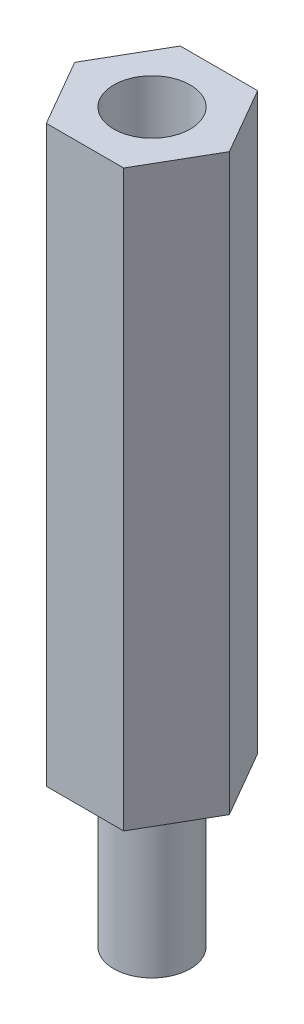
ISO-10303-21;
HEADER;
FILE_DESCRIPTION(('STEP AP214'),'2;1');
FILE_NAME('part.step','',(''),(''),'','','');
FILE_SCHEMA(('AUTOMOTIVE_DESIGN { 1 0 10303 214 1 1 1 1 }'));
ENDSEC;
DATA;
#1=APPLICATION_CONTEXT('core data for automotive mechanical design processes');
#2=APPLICATION_PROTOCOL_DEFINITION('international standard','automotive_design',2000,#1);
#3=PRODUCT_CONTEXT('',#1,'mechanical');
#4=PRODUCT('Part','Part','',(#3));
#5=PRODUCT_RELATED_PRODUCT_CATEGORY('part','',(#4));
#6=PRODUCT_DEFINITION_FORMATION('','',#4);
#7=PRODUCT_DEFINITION_CONTEXT('part definition',#1,'design');
#8=PRODUCT_DEFINITION('design','',#6,#7);
#9=PRODUCT_DEFINITION_SHAPE('','',#8);
#10=(LENGTH_UNIT() NAMED_UNIT(*) SI_UNIT(.MILLI.,.METRE.));
#11=(NAMED_UNIT(*) PLANE_ANGLE_UNIT() SI_UNIT($,.RADIAN.));
#12=(NAMED_UNIT(*) SI_UNIT($,.STERADIAN.) SOLID_ANGLE_UNIT());
#13=UNCERTAINTY_MEASURE_WITH_UNIT(LENGTH_MEASURE(1.E-05),#10,'distance_accuracy_value','');
#14=(GEOMETRIC_REPRESENTATION_CONTEXT(3) GLOBAL_UNCERTAINTY_ASSIGNED_CONTEXT((#13)) GLOBAL_UNIT_ASSIGNED_CONTEXT((#10,
#11,#12)) REPRESENTATION_CONTEXT('',''));
#15=CARTESIAN_POINT('',(0.,0.,0.));
#16=DIRECTION('',(0.,0.,1.));
#17=DIRECTION('',(1.,0.,0.));
#18=AXIS2_PLACEMENT_3D('',#15,#16,#17);
#19=CARTESIAN_POINT('',(0.,-8.,0.));
#20=DIRECTION('',(0.,1.,0.));
#21=DIRECTION('',(0.,0.,1.));
#22=AXIS2_PLACEMENT_3D('',#19,#20,#21);
#23=CYLINDRICAL_SURFACE('',#22,2.);
#24=CARTESIAN_POINT('',(0.,-8.,0.));
#25=DIRECTION('',(0.,-1.,0.));
#26=DIRECTION('',(0.,0.,-1.));
#27=AXIS2_PLACEMENT_3D('',#24,#25,#26);
#28=CIRCLE('',#27,2.);
#29=CARTESIAN_POINT('',(0.,-8.,-2.));
#30=VERTEX_POINT('',#29);
#31=EDGE_CURVE('E11',#30,#30,#28,.T.);
#32=ORIENTED_EDGE('',*,*,#31,.F.);
#33=EDGE_LOOP('',(#32));
#34=FACE_BOUND('',#33,.T.);
#35=CARTESIAN_POINT('',(0.,0.,0.));
#36=DIRECTION('',(0.,-1.,0.));
#37=DIRECTION('',(0.,0.,-1.));
#38=AXIS2_PLACEMENT_3D('',#35,#36,#37);
#39=CIRCLE('',#38,2.);
#40=CARTESIAN_POINT('',(0.,0.,-2.));
#41=VERTEX_POINT('',#40);
#42=EDGE_CURVE('E45',#41,#41,#39,.T.);
#43=ORIENTED_EDGE('',*,*,#42,.T.);
#44=EDGE_LOOP('',(#43));
#45=FACE_BOUND('',#44,.T.);
#46=ADVANCED_FACE('F42',(#34,#45),#23,.T.);
#47=CARTESIAN_POINT('',(0.,-8.,0.));
#48=DIRECTION('',(0.,-1.,0.));
#49=DIRECTION('',(0.,0.,-1.));
#50=AXIS2_PLACEMENT_3D('',#47,#48,#49);
#51=PLANE('',#50);
#52=ORIENTED_EDGE('',*,*,#31,.T.);
#53=EDGE_LOOP('',(#52));
#54=FACE_BOUND('',#53,.T.);
#55=ADVANCED_FACE('F57',(#54),#51,.T.);
#56=CARTESIAN_POINT('',(0.,0.,0.));
#57=DIRECTION('',(0.,-1.,0.));
#58=DIRECTION('',(0.,0.,-1.));
#59=AXIS2_PLACEMENT_3D('',#56,#57,#58);
#60=PLANE('',#59);
#61=ORIENTED_EDGE('',*,*,#42,.F.);
#62=EDGE_LOOP('',(#61));
#63=FACE_BOUND('',#62,.T.);
#64=ADVANCED_FACE('F55',(#63),#60,.F.);
#65=CLOSED_SHELL('',(#46,#55,#64));
#66=MANIFOLD_SOLID_BREP('B2',#65);
#67=CARTESIAN_POINT('',(0.,30.,0.));
#68=DIRECTION('',(0.,1.,0.));
#69=DIRECTION('',(0.,0.,1.));
#70=AXIS2_PLACEMENT_3D('',#67,#68,#69);
#71=PLANE('',#70);
#72=DIRECTION('',(0.5,0.,-0.866025403784439));
#73=VECTOR('',#72,1.);
#74=CARTESIAN_POINT('',(2.02072594216369,30.,3.5));
#75=LINE('',#74,#73);
#76=CARTESIAN_POINT('',(2.02072594216369,30.,3.5));
#77=VERTEX_POINT('',#76);
#78=CARTESIAN_POINT('',(4.04145188432738,30.,0.));
#79=VERTEX_POINT('',#78);
#80=EDGE_CURVE('E178',#77,#79,#75,.T.);
#81=ORIENTED_EDGE('',*,*,#80,.T.);
#82=DIRECTION('',(-0.5,0.,-0.866025403784438));
#83=VECTOR('',#82,1.);
#84=CARTESIAN_POINT('',(4.04145188432738,30.,0.));
#85=LINE('',#84,#83);
#86=CARTESIAN_POINT('',(2.02072594216369,30.,-3.5));
#87=VERTEX_POINT('',#86);
#88=EDGE_CURVE('E136',#79,#87,#85,.T.);
#89=ORIENTED_EDGE('',*,*,#88,.T.);
#90=DIRECTION('',(-1.,0.,0.));
#91=VECTOR('',#90,1.);
#92=CARTESIAN_POINT('',(2.02072594216369,30.,-3.5));
#93=LINE('',#92,#91);
#94=CARTESIAN_POINT('',(-2.02072594216369,30.,-3.5));
#95=VERTEX_POINT('',#94);
#96=EDGE_CURVE('E149',#87,#95,#93,.T.);
#97=ORIENTED_EDGE('',*,*,#96,.T.);
#98=DIRECTION('',(-0.5,0.,0.866025403784439));
#99=VECTOR('',#98,1.);
#100=CARTESIAN_POINT('',(-2.02072594216369,30.,-3.5));
#101=LINE('',#100,#99);
#102=CARTESIAN_POINT('',(-4.04145188432738,30.,0.));
#103=VERTEX_POINT('',#102);
#104=EDGE_CURVE('E143',#95,#103,#101,.T.);
#105=ORIENTED_EDGE('',*,*,#104,.T.);
#106=DIRECTION('',(0.5,0.,0.866025403784438));
#107=VECTOR('',#106,1.);
#108=CARTESIAN_POINT('',(-4.04145188432738,30.,0.));
#109=LINE('',#108,#107);
#110=CARTESIAN_POINT('',(-2.02072594216369,30.,3.5));
#111=VERTEX_POINT('',#110);
#112=EDGE_CURVE('E147',#103,#111,#109,.T.);
#113=ORIENTED_EDGE('',*,*,#112,.T.);
#114=DIRECTION('',(1.,0.,0.));
#115=VECTOR('',#114,1.);
#116=CARTESIAN_POINT('',(-2.02072594216369,30.,3.5));
#117=LINE('',#116,#115);
#118=EDGE_CURVE('E99',#111,#77,#117,.T.);
#119=ORIENTED_EDGE('',*,*,#118,.T.);
#120=EDGE_LOOP('',(#81,#89,#97,#105,#113,#119));
#121=FACE_BOUND('',#120,.T.);
#122=CARTESIAN_POINT('',(0.,30.,0.));
#123=DIRECTION('',(0.,1.,0.));
#124=DIRECTION('',(0.,0.,1.));
#125=AXIS2_PLACEMENT_3D('',#122,#123,#124);
#126=CIRCLE('',#125,2.);
#127=CARTESIAN_POINT('',(0.,30.,2.));
#128=VERTEX_POINT('',#127);
#129=EDGE_CURVE('E171',#128,#128,#126,.T.);
#130=ORIENTED_EDGE('',*,*,#129,.F.);
#131=EDGE_LOOP('',(#130));
#132=FACE_BOUND('',#131,.T.);
#133=ADVANCED_FACE('F82',(#121,#132),#71,.T.);
#134=CARTESIAN_POINT('',(0.,0.,0.));
#135=DIRECTION('',(0.,1.,0.));
#136=DIRECTION('',(0.,0.,1.));
#137=AXIS2_PLACEMENT_3D('',#134,#135,#136);
#138=PLANE('',#137);
#139=DIRECTION('',(0.5,0.,-0.866025403784439));
#140=VECTOR('',#139,1.);
#141=CARTESIAN_POINT('',(2.02072594216369,0.,3.5));
#142=LINE('',#141,#140);
#143=CARTESIAN_POINT('',(2.02072594216369,0.,3.5));
#144=VERTEX_POINT('',#143);
#145=CARTESIAN_POINT('',(4.04145188432738,0.,0.));
#146=VERTEX_POINT('',#145);
#147=EDGE_CURVE('E167',#144,#146,#142,.T.);
#148=ORIENTED_EDGE('',*,*,#147,.F.);
#149=DIRECTION('',(1.,0.,0.));
#150=VECTOR('',#149,1.);
#151=CARTESIAN_POINT('',(-2.02072594216369,0.,3.5));
#152=LINE('',#151,#150);
#153=CARTESIAN_POINT('',(-2.02072594216369,0.,3.5));
#154=VERTEX_POINT('',#153);
#155=EDGE_CURVE('E128',#154,#144,#152,.T.);
#156=ORIENTED_EDGE('',*,*,#155,.F.);
#157=DIRECTION('',(0.5,0.,0.866025403784438));
#158=VECTOR('',#157,1.);
#159=CARTESIAN_POINT('',(-4.04145188432738,0.,0.));
#160=LINE('',#159,#158);
#161=CARTESIAN_POINT('',(-4.04145188432738,0.,0.));
#162=VERTEX_POINT('',#161);
#163=EDGE_CURVE('E122',#162,#154,#160,.T.);
#164=ORIENTED_EDGE('',*,*,#163,.F.);
#165=DIRECTION('',(-0.5,0.,0.866025403784439));
#166=VECTOR('',#165,1.);
#167=CARTESIAN_POINT('',(-2.02072594216369,0.,-3.5));
#168=LINE('',#167,#166);
#169=CARTESIAN_POINT('',(-2.02072594216369,0.,-3.5));
#170=VERTEX_POINT('',#169);
#171=EDGE_CURVE('E157',#170,#162,#168,.T.);
#172=ORIENTED_EDGE('',*,*,#171,.F.);
#173=DIRECTION('',(-1.,0.,0.));
#174=VECTOR('',#173,1.);
#175=CARTESIAN_POINT('',(2.02072594216369,0.,-3.5));
#176=LINE('',#175,#174);
#177=CARTESIAN_POINT('',(2.02072594216369,0.,-3.5));
#178=VERTEX_POINT('',#177);
#179=EDGE_CURVE('E173',#178,#170,#176,.T.);
#180=ORIENTED_EDGE('',*,*,#179,.F.);
#181=DIRECTION('',(-0.5,0.,-0.866025403784438));
#182=VECTOR('',#181,1.);
#183=CARTESIAN_POINT('',(4.04145188432738,0.,0.));
#184=LINE('',#183,#182);
#185=EDGE_CURVE('E170',#146,#178,#184,.T.);
#186=ORIENTED_EDGE('',*,*,#185,.F.);
#187=EDGE_LOOP('',(#148,#156,#164,#172,#180,#186));
#188=FACE_BOUND('',#187,.T.);
#189=CARTESIAN_POINT('',(0.,0.,0.));
#190=DIRECTION('',(0.,1.,0.));
#191=DIRECTION('',(0.,0.,1.));
#192=AXIS2_PLACEMENT_3D('',#189,#190,#191);
#193=CIRCLE('',#192,2.);
#194=CARTESIAN_POINT('',(0.,0.,2.));
#195=VERTEX_POINT('',#194);
#196=EDGE_CURVE('E271',#195,#195,#193,.T.);
#197=ORIENTED_EDGE('',*,*,#196,.T.);
#198=EDGE_LOOP('',(#197));
#199=FACE_BOUND('',#198,.T.);
#200=ADVANCED_FACE('F187',(#188,#199),#138,.F.);
#201=CARTESIAN_POINT('',(2.02072594216369,30.,3.5));
#202=DIRECTION('',(-0.866025403784438,0.,-0.5));
#203=DIRECTION('',(-0.5,0.,0.866025403784439));
#204=AXIS2_PLACEMENT_3D('',#201,#202,#203);
#205=PLANE('',#204);
#206=ORIENTED_EDGE('',*,*,#147,.T.);
#207=DIRECTION('',(0.,-1.,0.));
#208=VECTOR('',#207,1.);
#209=CARTESIAN_POINT('',(4.04145188432738,30.,0.));
#210=LINE('',#209,#208);
#211=EDGE_CURVE('E40',#79,#146,#210,.T.);
#212=ORIENTED_EDGE('',*,*,#211,.F.);
#213=ORIENTED_EDGE('',*,*,#80,.F.);
#214=DIRECTION('',(0.,-1.,0.));
#215=VECTOR('',#214,1.);
#216=CARTESIAN_POINT('',(2.02072594216369,30.,3.5));
#217=LINE('',#216,#215);
#218=EDGE_CURVE('E163',#77,#144,#217,.T.);
#219=ORIENTED_EDGE('',*,*,#218,.T.);
#220=EDGE_LOOP('',(#206,#212,#213,#219));
#221=FACE_BOUND('',#220,.T.);
#222=ADVANCED_FACE('F84',(#221),#205,.F.);
#223=CARTESIAN_POINT('',(4.04145188432738,30.,0.));
#224=DIRECTION('',(-0.866025403784438,0.,0.5));
#225=DIRECTION('',(0.5,0.,0.866025403784439));
#226=AXIS2_PLACEMENT_3D('',#223,#224,#225);
#227=PLANE('',#226);
#228=ORIENTED_EDGE('',*,*,#185,.T.);
#229=DIRECTION('',(0.,-1.,0.));
#230=VECTOR('',#229,1.);
#231=CARTESIAN_POINT('',(2.02072594216369,30.,-3.5));
#232=LINE('',#231,#230);
#233=EDGE_CURVE('E91',#87,#178,#232,.T.);
#234=ORIENTED_EDGE('',*,*,#233,.F.);
#235=ORIENTED_EDGE('',*,*,#88,.F.);
#236=ORIENTED_EDGE('',*,*,#211,.T.);
#237=EDGE_LOOP('',(#228,#234,#235,#236));
#238=FACE_BOUND('',#237,.T.);
#239=ADVANCED_FACE('F212',(#238),#227,.F.);
#240=CARTESIAN_POINT('',(2.02072594216369,30.,-3.5));
#241=DIRECTION('',(0.,0.,1.));
#242=DIRECTION('',(1.,0.,0.));
#243=AXIS2_PLACEMENT_3D('',#240,#241,#242);
#244=PLANE('',#243);
#245=ORIENTED_EDGE('',*,*,#179,.T.);
#246=DIRECTION('',(0.,-1.,0.));
#247=VECTOR('',#246,1.);
#248=CARTESIAN_POINT('',(-2.02072594216369,30.,-3.5));
#249=LINE('',#248,#247);
#250=EDGE_CURVE('E158',#95,#170,#249,.T.);
#251=ORIENTED_EDGE('',*,*,#250,.F.);
#252=ORIENTED_EDGE('',*,*,#96,.F.);
#253=ORIENTED_EDGE('',*,*,#233,.T.);
#254=EDGE_LOOP('',(#245,#251,#252,#253));
#255=FACE_BOUND('',#254,.T.);
#256=ADVANCED_FACE('F184',(#255),#244,.F.);
#257=CARTESIAN_POINT('',(-2.02072594216369,30.,-3.5));
#258=DIRECTION('',(0.866025403784438,0.,0.5));
#259=DIRECTION('',(0.5,0.,-0.866025403784439));
#260=AXIS2_PLACEMENT_3D('',#257,#258,#259);
#261=PLANE('',#260);
#262=ORIENTED_EDGE('',*,*,#171,.T.);
#263=DIRECTION('',(0.,-1.,0.));
#264=VECTOR('',#263,1.);
#265=CARTESIAN_POINT('',(-4.04145188432738,30.,0.));
#266=LINE('',#265,#264);
#267=EDGE_CURVE('E154',#103,#162,#266,.T.);
#268=ORIENTED_EDGE('',*,*,#267,.F.);
#269=ORIENTED_EDGE('',*,*,#104,.F.);
#270=ORIENTED_EDGE('',*,*,#250,.T.);
#271=EDGE_LOOP('',(#262,#268,#269,#270));
#272=FACE_BOUND('',#271,.T.);
#273=ADVANCED_FACE('F155',(#272),#261,.F.);
#274=CARTESIAN_POINT('',(-4.04145188432738,30.,0.));
#275=DIRECTION('',(0.866025403784438,0.,-0.5));
#276=DIRECTION('',(-0.5,0.,-0.866025403784438));
#277=AXIS2_PLACEMENT_3D('',#274,#275,#276);
#278=PLANE('',#277);
#279=ORIENTED_EDGE('',*,*,#163,.T.);
#280=DIRECTION('',(0.,-1.,0.));
#281=VECTOR('',#280,1.);
#282=CARTESIAN_POINT('',(-2.02072594216369,30.,3.5));
#283=LINE('',#282,#281);
#284=EDGE_CURVE('E159',#111,#154,#283,.T.);
#285=ORIENTED_EDGE('',*,*,#284,.F.);
#286=ORIENTED_EDGE('',*,*,#112,.F.);
#287=ORIENTED_EDGE('',*,*,#267,.T.);
#288=EDGE_LOOP('',(#279,#285,#286,#287));
#289=FACE_BOUND('',#288,.T.);
#290=ADVANCED_FACE('F161',(#289),#278,.F.);
#291=CARTESIAN_POINT('',(-2.02072594216369,30.,3.5));
#292=DIRECTION('',(0.,0.,-1.));
#293=DIRECTION('',(-1.,0.,0.));
#294=AXIS2_PLACEMENT_3D('',#291,#292,#293);
#295=PLANE('',#294);
#296=ORIENTED_EDGE('',*,*,#155,.T.);
#297=ORIENTED_EDGE('',*,*,#218,.F.);
#298=ORIENTED_EDGE('',*,*,#118,.F.);
#299=ORIENTED_EDGE('',*,*,#284,.T.);
#300=EDGE_LOOP('',(#296,#297,#298,#299));
#301=FACE_BOUND('',#300,.T.);
#302=ADVANCED_FACE('F192',(#301),#295,.F.);
#303=CARTESIAN_POINT('',(0.,30.,0.));
#304=DIRECTION('',(0.,-1.,0.));
#305=DIRECTION('',(0.,0.,-1.));
#306=AXIS2_PLACEMENT_3D('',#303,#304,#305);
#307=CYLINDRICAL_SURFACE('',#306,2.);
#308=ORIENTED_EDGE('',*,*,#129,.T.);
#309=EDGE_LOOP('',(#308));
#310=FACE_BOUND('',#309,.T.);
#311=ORIENTED_EDGE('',*,*,#196,.F.);
#312=EDGE_LOOP('',(#311));
#313=FACE_BOUND('',#312,.T.);
#314=ADVANCED_FACE('F194',(#310,#313),#307,.F.);
#315=CLOSED_SHELL('',(#133,#200,#222,#239,#256,#273,#290,#302,#314));
#316=MANIFOLD_SOLID_BREP('B6',#315);
#317=ADVANCED_BREP_SHAPE_REPRESENTATION('',(#18,#66,#316),#14);
#318=SHAPE_DEFINITION_REPRESENTATION(#9,#317);
ENDSEC;
END-ISO-10303-21;
